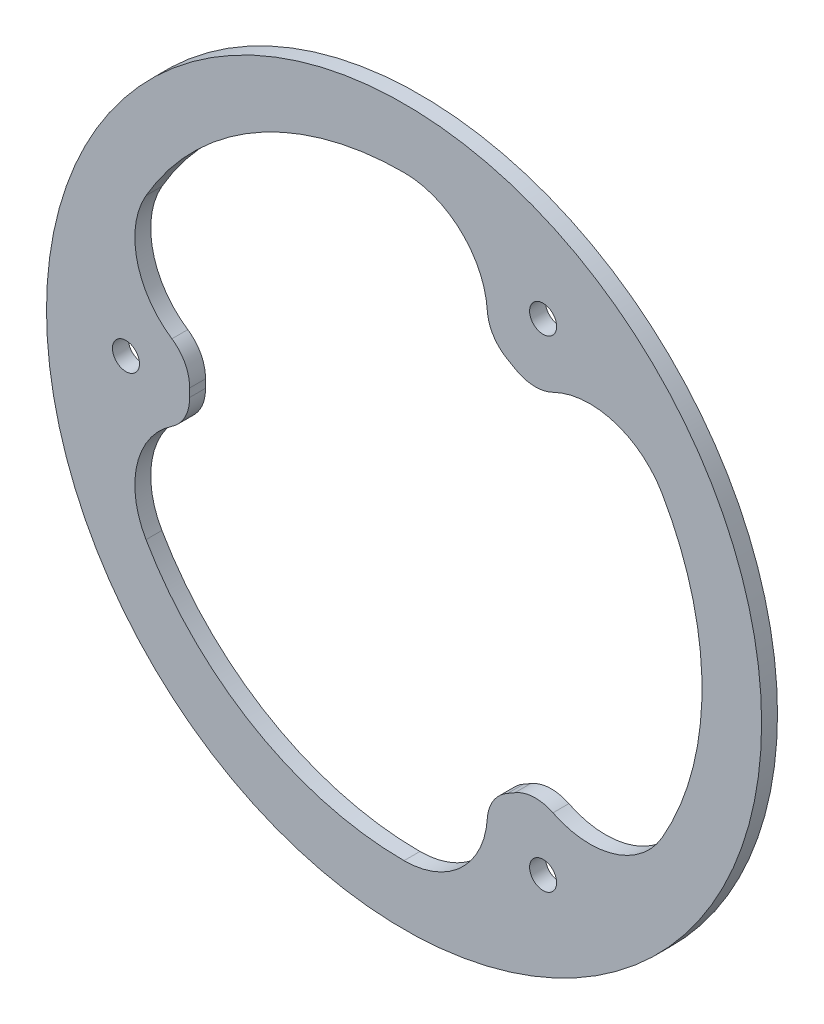
ISO-10303-21;
HEADER;
FILE_DESCRIPTION(('STEP AP214'),'2;1');
FILE_NAME('part.step','',(''),(''),'','','');
FILE_SCHEMA(('AUTOMOTIVE_DESIGN { 1 0 10303 214 1 1 1 1 }'));
ENDSEC;
DATA;
#1=APPLICATION_CONTEXT('core data for automotive mechanical design processes');
#2=APPLICATION_PROTOCOL_DEFINITION('international standard','automotive_design',2000,#1);
#3=PRODUCT_CONTEXT('',#1,'mechanical');
#4=PRODUCT('Part','Part','',(#3));
#5=PRODUCT_RELATED_PRODUCT_CATEGORY('part','',(#4));
#6=PRODUCT_DEFINITION_FORMATION('','',#4);
#7=PRODUCT_DEFINITION_CONTEXT('part definition',#1,'design');
#8=PRODUCT_DEFINITION('design','',#6,#7);
#9=PRODUCT_DEFINITION_SHAPE('','',#8);
#10=(LENGTH_UNIT() NAMED_UNIT(*) SI_UNIT(.MILLI.,.METRE.));
#11=(NAMED_UNIT(*) PLANE_ANGLE_UNIT() SI_UNIT($,.RADIAN.));
#12=(NAMED_UNIT(*) SI_UNIT($,.STERADIAN.) SOLID_ANGLE_UNIT());
#13=UNCERTAINTY_MEASURE_WITH_UNIT(LENGTH_MEASURE(1.E-05),#10,'distance_accuracy_value','');
#14=(GEOMETRIC_REPRESENTATION_CONTEXT(3) GLOBAL_UNCERTAINTY_ASSIGNED_CONTEXT((#13)) GLOBAL_UNIT_ASSIGNED_CONTEXT((#10,
#11,#12)) REPRESENTATION_CONTEXT('',''));
#15=CARTESIAN_POINT('',(0.,0.,0.));
#16=DIRECTION('',(0.,0.,1.));
#17=DIRECTION('',(1.,0.,0.));
#18=AXIS2_PLACEMENT_3D('',#15,#16,#17);
#19=CARTESIAN_POINT('',(0.,0.,14.));
#20=DIRECTION('',(0.,0.,1.));
#21=DIRECTION('',(1.,0.,0.));
#22=AXIS2_PLACEMENT_3D('',#19,#20,#21);
#23=PLANE('',#22);
#24=CARTESIAN_POINT('',(0.,0.,14.));
#25=DIRECTION('',(0.,0.,-1.));
#26=DIRECTION('',(-1.,0.,0.));
#27=AXIS2_PLACEMENT_3D('',#24,#25,#26);
#28=CIRCLE('',#27,27.);
#29=CARTESIAN_POINT('',(-26.9950568827488,-0.516627425867208,14.));
#30=VERTEX_POINT('',#29);
#31=CARTESIAN_POINT('',(-26.9950568827488,0.516627425867155,14.));
#32=VERTEX_POINT('',#31);
#33=EDGE_CURVE('E288',#30,#32,#28,.T.);
#34=ORIENTED_EDGE('',*,*,#33,.T.);
#35=CARTESIAN_POINT('',(-31.9941414906652,0.612299171398109,14.));
#36=DIRECTION('',(0.,0.,1.));
#37=DIRECTION('',(1.,0.,0.));
#38=AXIS2_PLACEMENT_3D('',#35,#36,#37);
#39=CIRCLE('',#38,5.);
#40=CARTESIAN_POINT('',(-29.2162525911538,4.76962201933419,14.));
#41=VERTEX_POINT('',#40);
#42=EDGE_CURVE('E262',#32,#41,#39,.T.);
#43=ORIENTED_EDGE('',*,*,#42,.T.);
#44=CARTESIAN_POINT('',(-23.3826859021799,13.4999999999999,14.));
#45=DIRECTION('',(0.,0.,-1.));
#46=DIRECTION('',(-1.,0.,0.));
#47=AXIS2_PLACEMENT_3D('',#44,#45,#46);
#48=CIRCLE('',#47,10.5);
#49=CARTESIAN_POINT('',(-32.4759526419165,18.7499999999999,14.));
#50=VERTEX_POINT('',#49);
#51=EDGE_CURVE('E209',#41,#50,#48,.T.);
#52=ORIENTED_EDGE('',*,*,#51,.T.);
#53=CARTESIAN_POINT('',(0.,0.,14.));
#54=DIRECTION('',(0.,0.,-1.));
#55=DIRECTION('',(-1.,0.,0.));
#56=AXIS2_PLACEMENT_3D('',#53,#54,#55);
#57=CIRCLE('',#56,37.5);
#58=CARTESIAN_POINT('',(0.,37.5,14.));
#59=VERTEX_POINT('',#58);
#60=EDGE_CURVE('E213',#50,#59,#57,.T.);
#61=ORIENTED_EDGE('',*,*,#60,.T.);
#62=CARTESIAN_POINT('',(0.,27.,14.));
#63=DIRECTION('',(0.,0.,-1.));
#64=DIRECTION('',(-1.,0.,0.));
#65=AXIS2_PLACEMENT_3D('',#62,#63,#64);
#66=CIRCLE('',#65,10.5);
#67=CARTESIAN_POINT('',(10.4775124603838,27.6868279569892,14.));
#68=VERTEX_POINT('',#67);
#69=EDGE_CURVE('E216',#59,#68,#66,.T.);
#70=ORIENTED_EDGE('',*,*,#69,.T.);
#71=CARTESIAN_POINT('',(15.4668041081856,28.0138888888889,14.));
#72=DIRECTION('',(0.,0.,1.));
#73=DIRECTION('',(1.,0.,0.));
#74=AXIS2_PLACEMENT_3D('',#71,#72,#73);
#75=CIRCLE('',#74,5.);
#76=CARTESIAN_POINT('',(13.0501159662816,23.63671875,14.));
#77=VERTEX_POINT('',#76);
#78=EDGE_CURVE('E51',#68,#77,#75,.T.);
#79=ORIENTED_EDGE('',*,*,#78,.T.);
#80=CARTESIAN_POINT('',(13.9449409164671,23.1200913241328,14.));
#81=VERTEX_POINT('',#80);
#82=EDGE_CURVE('E236',#77,#81,#28,.T.);
#83=ORIENTED_EDGE('',*,*,#82,.T.);
#84=CARTESIAN_POINT('',(16.5273373824795,27.4015897174907,14.));
#85=DIRECTION('',(0.,0.,1.));
#86=DIRECTION('',(1.,0.,0.));
#87=AXIS2_PLACEMENT_3D('',#84,#85,#86);
#88=CIRCLE('',#87,5.);
#89=CARTESIAN_POINT('',(18.7387401307699,22.917205937655,14.));
#90=VERTEX_POINT('',#89);
#91=EDGE_CURVE('E254',#81,#90,#88,.T.);
#92=ORIENTED_EDGE('',*,*,#91,.T.);
#93=CARTESIAN_POINT('',(23.3826859021798,13.5,14.));
#94=DIRECTION('',(0.,0.,-1.));
#95=DIRECTION('',(-1.,0.,0.));
#96=AXIS2_PLACEMENT_3D('',#93,#94,#95);
#97=CIRCLE('',#96,10.5);
#98=CARTESIAN_POINT('',(32.4759526419164,18.7500000000001,14.));
#99=VERTEX_POINT('',#98);
#100=EDGE_CURVE('E327',#90,#99,#97,.T.);
#101=ORIENTED_EDGE('',*,*,#100,.T.);
#102=CARTESIAN_POINT('',(0.,0.,14.));
#103=DIRECTION('',(0.,0.,-1.));
#104=DIRECTION('',(-1.,0.,0.));
#105=AXIS2_PLACEMENT_3D('',#102,#103,#104);
#106=CIRCLE('',#105,37.5);
#107=CARTESIAN_POINT('',(32.4759526419165,-18.75,14.));
#108=VERTEX_POINT('',#107);
#109=EDGE_CURVE('E328',#99,#108,#106,.T.);
#110=ORIENTED_EDGE('',*,*,#109,.T.);
#111=CARTESIAN_POINT('',(23.3826859021798,-13.5,14.));
#112=DIRECTION('',(0.,0.,-1.));
#113=DIRECTION('',(-1.,0.,0.));
#114=AXIS2_PLACEMENT_3D('',#111,#112,#113);
#115=CIRCLE('',#114,10.5);
#116=CARTESIAN_POINT('',(18.73874013077,-22.917205937655,14.));
#117=VERTEX_POINT('',#116);
#118=EDGE_CURVE('E190',#108,#117,#115,.T.);
#119=ORIENTED_EDGE('',*,*,#118,.T.);
#120=CARTESIAN_POINT('',(16.5273373824796,-27.4015897174907,14.));
#121=DIRECTION('',(0.,0.,1.));
#122=DIRECTION('',(1.,0.,0.));
#123=AXIS2_PLACEMENT_3D('',#120,#121,#122);
#124=CIRCLE('',#123,5.);
#125=CARTESIAN_POINT('',(13.9449409164672,-23.1200913241328,14.));
#126=VERTEX_POINT('',#125);
#127=EDGE_CURVE('E259',#117,#126,#124,.T.);
#128=ORIENTED_EDGE('',*,*,#127,.T.);
#129=CARTESIAN_POINT('',(13.0501159662817,-23.63671875,14.));
#130=VERTEX_POINT('',#129);
#131=EDGE_CURVE('E331',#126,#130,#28,.T.);
#132=ORIENTED_EDGE('',*,*,#131,.T.);
#133=CARTESIAN_POINT('',(15.4668041081857,-28.0138888888889,14.));
#134=DIRECTION('',(0.,0.,1.));
#135=DIRECTION('',(1.,0.,0.));
#136=AXIS2_PLACEMENT_3D('',#133,#134,#135);
#137=CIRCLE('',#136,5.);
#138=CARTESIAN_POINT('',(10.4775124603839,-27.6868279569892,14.));
#139=VERTEX_POINT('',#138);
#140=EDGE_CURVE('E257',#130,#139,#137,.T.);
#141=ORIENTED_EDGE('',*,*,#140,.T.);
#142=CARTESIAN_POINT('',(0.,-27.,14.));
#143=DIRECTION('',(0.,0.,-1.));
#144=DIRECTION('',(-1.,0.,0.));
#145=AXIS2_PLACEMENT_3D('',#142,#143,#144);
#146=CIRCLE('',#145,10.5);
#147=CARTESIAN_POINT('',(0.,-37.5,14.));
#148=VERTEX_POINT('',#147);
#149=EDGE_CURVE('E192',#139,#148,#146,.T.);
#150=ORIENTED_EDGE('',*,*,#149,.T.);
#151=CARTESIAN_POINT('',(0.,0.,14.));
#152=DIRECTION('',(0.,0.,-1.));
#153=DIRECTION('',(-1.,0.,0.));
#154=AXIS2_PLACEMENT_3D('',#151,#152,#153);
#155=CIRCLE('',#154,37.5);
#156=CARTESIAN_POINT('',(-32.4759526419165,-18.75,14.));
#157=VERTEX_POINT('',#156);
#158=EDGE_CURVE('E194',#148,#157,#155,.T.);
#159=ORIENTED_EDGE('',*,*,#158,.T.);
#160=CARTESIAN_POINT('',(-23.3826859021798,-13.5,14.));
#161=DIRECTION('',(0.,0.,-1.));
#162=DIRECTION('',(-1.,0.,0.));
#163=AXIS2_PLACEMENT_3D('',#160,#161,#162);
#164=CIRCLE('',#163,10.5);
#165=CARTESIAN_POINT('',(-29.2162525911538,-4.76962201933425,14.));
#166=VERTEX_POINT('',#165);
#167=EDGE_CURVE('E202',#157,#166,#164,.T.);
#168=ORIENTED_EDGE('',*,*,#167,.T.);
#169=CARTESIAN_POINT('',(-31.9941414906652,-0.612299171398172,14.));
#170=DIRECTION('',(0.,0.,1.));
#171=DIRECTION('',(1.,0.,0.));
#172=AXIS2_PLACEMENT_3D('',#169,#170,#171);
#173=CIRCLE('',#172,5.);
#174=EDGE_CURVE('E59',#166,#30,#173,.T.);
#175=ORIENTED_EDGE('',*,*,#174,.T.);
#176=EDGE_LOOP('',(#34,#43,#52,#61,#70,#79,#83,#92,#101,#110,#119,#128,#132,#141,#150,#159,#168,#175));
#177=FACE_BOUND('',#176,.T.);
#178=CARTESIAN_POINT('',(17.4999999999999,30.3108891324554,14.));
#179=DIRECTION('',(0.,0.,-1.));
#180=DIRECTION('',(-1.,0.,0.));
#181=AXIS2_PLACEMENT_3D('',#178,#179,#180);
#182=CIRCLE('',#181,1.7);
#183=CARTESIAN_POINT('',(15.7999999999999,30.3108891324554,14.));
#184=VERTEX_POINT('',#183);
#185=EDGE_CURVE('E315',#184,#184,#182,.T.);
#186=ORIENTED_EDGE('',*,*,#185,.T.);
#187=EDGE_LOOP('',(#186));
#188=FACE_BOUND('',#187,.T.);
#189=CARTESIAN_POINT('',(-35.,0.,14.));
#190=DIRECTION('',(0.,0.,-1.));
#191=DIRECTION('',(-1.,0.,0.));
#192=AXIS2_PLACEMENT_3D('',#189,#190,#191);
#193=CIRCLE('',#192,1.7);
#194=CARTESIAN_POINT('',(-36.7,0.,14.));
#195=VERTEX_POINT('',#194);
#196=EDGE_CURVE('E321',#195,#195,#193,.T.);
#197=ORIENTED_EDGE('',*,*,#196,.T.);
#198=EDGE_LOOP('',(#197));
#199=FACE_BOUND('',#198,.T.);
#200=CARTESIAN_POINT('',(17.4999999999998,-30.3108891324555,14.));
#201=DIRECTION('',(0.,0.,-1.));
#202=DIRECTION('',(-1.,0.,0.));
#203=AXIS2_PLACEMENT_3D('',#200,#201,#202);
#204=CIRCLE('',#203,1.7);
#205=CARTESIAN_POINT('',(15.7999999999998,-30.3108891324555,14.));
#206=VERTEX_POINT('',#205);
#207=EDGE_CURVE('E324',#206,#206,#204,.T.);
#208=ORIENTED_EDGE('',*,*,#207,.T.);
#209=EDGE_LOOP('',(#208));
#210=FACE_BOUND('',#209,.T.);
#211=CARTESIAN_POINT('',(0.,0.,14.));
#212=DIRECTION('',(0.,0.,1.));
#213=DIRECTION('',(1.,0.,0.));
#214=AXIS2_PLACEMENT_3D('',#211,#212,#213);
#215=CIRCLE('',#214,45.);
#216=CARTESIAN_POINT('',(45.,0.,14.));
#217=VERTEX_POINT('',#216);
#218=EDGE_CURVE('E226',#217,#217,#215,.T.);
#219=ORIENTED_EDGE('',*,*,#218,.T.);
#220=EDGE_LOOP('',(#219));
#221=FACE_BOUND('',#220,.T.);
#222=ADVANCED_FACE('F36',(#177,#188,#199,#210,#221),#23,.T.);
#223=CARTESIAN_POINT('',(0.,0.,12.));
#224=DIRECTION('',(0.,0.,1.));
#225=DIRECTION('',(1.,0.,0.));
#226=AXIS2_PLACEMENT_3D('',#223,#224,#225);
#227=PLANE('',#226);
#228=CARTESIAN_POINT('',(0.,0.,12.));
#229=DIRECTION('',(0.,0.,1.));
#230=DIRECTION('',(1.,0.,0.));
#231=AXIS2_PLACEMENT_3D('',#228,#229,#230);
#232=CIRCLE('',#231,45.);
#233=CARTESIAN_POINT('',(45.,0.,12.));
#234=VERTEX_POINT('',#233);
#235=EDGE_CURVE('E223',#234,#234,#232,.T.);
#236=ORIENTED_EDGE('',*,*,#235,.F.);
#237=EDGE_LOOP('',(#236));
#238=FACE_BOUND('',#237,.T.);
#239=CARTESIAN_POINT('',(17.4999999999998,-30.3108891324555,12.));
#240=DIRECTION('',(0.,0.,1.));
#241=DIRECTION('',(1.,0.,0.));
#242=AXIS2_PLACEMENT_3D('',#239,#240,#241);
#243=CIRCLE('',#242,1.69999999999999);
#244=CARTESIAN_POINT('',(19.1999999999998,-30.3108891324555,12.));
#245=VERTEX_POINT('',#244);
#246=EDGE_CURVE('E384',#245,#245,#243,.F.);
#247=ORIENTED_EDGE('',*,*,#246,.F.);
#248=EDGE_LOOP('',(#247));
#249=FACE_BOUND('',#248,.T.);
#250=CARTESIAN_POINT('',(17.4999999999999,30.3108891324554,12.));
#251=DIRECTION('',(0.,0.,1.));
#252=DIRECTION('',(1.,0.,0.));
#253=AXIS2_PLACEMENT_3D('',#250,#251,#252);
#254=CIRCLE('',#253,1.69999999999999);
#255=CARTESIAN_POINT('',(19.1999999999999,30.3108891324554,12.));
#256=VERTEX_POINT('',#255);
#257=EDGE_CURVE('E232',#256,#256,#254,.F.);
#258=ORIENTED_EDGE('',*,*,#257,.F.);
#259=EDGE_LOOP('',(#258));
#260=FACE_BOUND('',#259,.T.);
#261=CARTESIAN_POINT('',(-35.,0.,12.));
#262=DIRECTION('',(0.,0.,1.));
#263=DIRECTION('',(1.,0.,0.));
#264=AXIS2_PLACEMENT_3D('',#261,#262,#263);
#265=CIRCLE('',#264,1.69999999999999);
#266=CARTESIAN_POINT('',(-33.3,0.,12.));
#267=VERTEX_POINT('',#266);
#268=EDGE_CURVE('E235',#267,#267,#265,.F.);
#269=ORIENTED_EDGE('',*,*,#268,.F.);
#270=EDGE_LOOP('',(#269));
#271=FACE_BOUND('',#270,.T.);
#272=CARTESIAN_POINT('',(-23.3826859021799,13.4999999999999,12.));
#273=DIRECTION('',(0.,0.,1.));
#274=DIRECTION('',(1.,0.,0.));
#275=AXIS2_PLACEMENT_3D('',#272,#273,#274);
#276=CIRCLE('',#275,10.5);
#277=CARTESIAN_POINT('',(-29.2162525911538,4.76962201933419,12.));
#278=VERTEX_POINT('',#277);
#279=CARTESIAN_POINT('',(-32.4759526419165,18.7499999999999,12.));
#280=VERTEX_POINT('',#279);
#281=EDGE_CURVE('E309',#278,#280,#276,.F.);
#282=ORIENTED_EDGE('',*,*,#281,.F.);
#283=CARTESIAN_POINT('',(-31.9941414906652,0.612299171398109,12.));
#284=DIRECTION('',(0.,0.,1.));
#285=DIRECTION('',(1.,0.,0.));
#286=AXIS2_PLACEMENT_3D('',#283,#284,#285);
#287=CIRCLE('',#286,5.);
#288=CARTESIAN_POINT('',(-26.9950568827488,0.516627425867155,12.));
#289=VERTEX_POINT('',#288);
#290=EDGE_CURVE('E248',#278,#289,#287,.F.);
#291=ORIENTED_EDGE('',*,*,#290,.T.);
#292=CARTESIAN_POINT('',(0.,0.,12.));
#293=DIRECTION('',(0.,0.,-1.));
#294=DIRECTION('',(-1.,0.,0.));
#295=AXIS2_PLACEMENT_3D('',#292,#293,#294);
#296=CIRCLE('',#295,27.);
#297=CARTESIAN_POINT('',(-26.9950568827488,-0.516627425867208,12.));
#298=VERTEX_POINT('',#297);
#299=EDGE_CURVE('E291',#298,#289,#296,.T.);
#300=ORIENTED_EDGE('',*,*,#299,.F.);
#301=CARTESIAN_POINT('',(-31.9941414906652,-0.612299171398172,12.));
#302=DIRECTION('',(0.,0.,1.));
#303=DIRECTION('',(1.,0.,0.));
#304=AXIS2_PLACEMENT_3D('',#301,#302,#303);
#305=CIRCLE('',#304,5.);
#306=CARTESIAN_POINT('',(-29.2162525911538,-4.76962201933425,12.));
#307=VERTEX_POINT('',#306);
#308=EDGE_CURVE('E246',#298,#307,#305,.F.);
#309=ORIENTED_EDGE('',*,*,#308,.T.);
#310=CARTESIAN_POINT('',(-23.3826859021798,-13.5,12.));
#311=DIRECTION('',(0.,0.,1.));
#312=DIRECTION('',(1.,0.,0.));
#313=AXIS2_PLACEMENT_3D('',#310,#311,#312);
#314=CIRCLE('',#313,10.5);
#315=CARTESIAN_POINT('',(-32.4759526419165,-18.75,12.));
#316=VERTEX_POINT('',#315);
#317=EDGE_CURVE('E312',#316,#307,#314,.F.);
#318=ORIENTED_EDGE('',*,*,#317,.F.);
#319=CARTESIAN_POINT('',(0.,0.,12.));
#320=DIRECTION('',(0.,0.,1.));
#321=DIRECTION('',(1.,0.,0.));
#322=AXIS2_PLACEMENT_3D('',#319,#320,#321);
#323=CIRCLE('',#322,37.5);
#324=CARTESIAN_POINT('',(0.,-37.5,12.));
#325=VERTEX_POINT('',#324);
#326=EDGE_CURVE('E391',#325,#316,#323,.F.);
#327=ORIENTED_EDGE('',*,*,#326,.F.);
#328=CARTESIAN_POINT('',(0.,-27.,12.));
#329=DIRECTION('',(0.,0.,1.));
#330=DIRECTION('',(1.,0.,0.));
#331=AXIS2_PLACEMENT_3D('',#328,#329,#330);
#332=CIRCLE('',#331,10.5);
#333=CARTESIAN_POINT('',(10.4775124603839,-27.6868279569892,12.));
#334=VERTEX_POINT('',#333);
#335=EDGE_CURVE('E177',#334,#325,#332,.F.);
#336=ORIENTED_EDGE('',*,*,#335,.F.);
#337=CARTESIAN_POINT('',(15.4668041081857,-28.0138888888889,12.));
#338=DIRECTION('',(0.,0.,1.));
#339=DIRECTION('',(1.,0.,0.));
#340=AXIS2_PLACEMENT_3D('',#337,#338,#339);
#341=CIRCLE('',#340,5.);
#342=CARTESIAN_POINT('',(13.0501159662817,-23.63671875,12.));
#343=VERTEX_POINT('',#342);
#344=EDGE_CURVE('E243',#334,#343,#341,.F.);
#345=ORIENTED_EDGE('',*,*,#344,.T.);
#346=CARTESIAN_POINT('',(13.9449409164672,-23.1200913241328,12.));
#347=VERTEX_POINT('',#346);
#348=EDGE_CURVE('E289',#347,#343,#296,.T.);
#349=ORIENTED_EDGE('',*,*,#348,.F.);
#350=CARTESIAN_POINT('',(16.5273373824796,-27.4015897174907,12.));
#351=DIRECTION('',(0.,0.,1.));
#352=DIRECTION('',(1.,0.,0.));
#353=AXIS2_PLACEMENT_3D('',#350,#351,#352);
#354=CIRCLE('',#353,5.);
#355=CARTESIAN_POINT('',(18.73874013077,-22.917205937655,12.));
#356=VERTEX_POINT('',#355);
#357=EDGE_CURVE('E172',#347,#356,#354,.F.);
#358=ORIENTED_EDGE('',*,*,#357,.T.);
#359=CARTESIAN_POINT('',(23.3826859021798,-13.5,12.));
#360=DIRECTION('',(0.,0.,1.));
#361=DIRECTION('',(1.,0.,0.));
#362=AXIS2_PLACEMENT_3D('',#359,#360,#361);
#363=CIRCLE('',#362,10.5);
#364=CARTESIAN_POINT('',(32.4759526419164,-18.75,12.));
#365=VERTEX_POINT('',#364);
#366=EDGE_CURVE('E163',#365,#356,#363,.F.);
#367=ORIENTED_EDGE('',*,*,#366,.F.);
#368=CARTESIAN_POINT('',(0.,0.,12.));
#369=DIRECTION('',(0.,0.,1.));
#370=DIRECTION('',(1.,0.,0.));
#371=AXIS2_PLACEMENT_3D('',#368,#369,#370);
#372=CIRCLE('',#371,37.5);
#373=CARTESIAN_POINT('',(32.4759526419164,18.7500000000001,12.));
#374=VERTEX_POINT('',#373);
#375=EDGE_CURVE('E168',#374,#365,#372,.F.);
#376=ORIENTED_EDGE('',*,*,#375,.F.);
#377=CARTESIAN_POINT('',(23.3826859021798,13.5,12.));
#378=DIRECTION('',(0.,0.,1.));
#379=DIRECTION('',(1.,0.,0.));
#380=AXIS2_PLACEMENT_3D('',#377,#378,#379);
#381=CIRCLE('',#380,10.5);
#382=CARTESIAN_POINT('',(18.7387401307699,22.917205937655,12.));
#383=VERTEX_POINT('',#382);
#384=EDGE_CURVE('E186',#383,#374,#381,.F.);
#385=ORIENTED_EDGE('',*,*,#384,.F.);
#386=CARTESIAN_POINT('',(16.5273373824795,27.4015897174907,12.));
#387=DIRECTION('',(0.,0.,1.));
#388=DIRECTION('',(1.,0.,0.));
#389=AXIS2_PLACEMENT_3D('',#386,#387,#388);
#390=CIRCLE('',#389,5.);
#391=CARTESIAN_POINT('',(13.9449409164671,23.1200913241328,12.));
#392=VERTEX_POINT('',#391);
#393=EDGE_CURVE('E239',#383,#392,#390,.F.);
#394=ORIENTED_EDGE('',*,*,#393,.T.);
#395=CARTESIAN_POINT('',(13.0501159662816,23.63671875,12.));
#396=VERTEX_POINT('',#395);
#397=EDGE_CURVE('E283',#396,#392,#296,.T.);
#398=ORIENTED_EDGE('',*,*,#397,.F.);
#399=CARTESIAN_POINT('',(15.4668041081856,28.0138888888889,12.));
#400=DIRECTION('',(0.,0.,1.));
#401=DIRECTION('',(1.,0.,0.));
#402=AXIS2_PLACEMENT_3D('',#399,#400,#401);
#403=CIRCLE('',#402,5.);
#404=CARTESIAN_POINT('',(10.4775124603838,27.6868279569892,12.));
#405=VERTEX_POINT('',#404);
#406=EDGE_CURVE('E241',#396,#405,#403,.F.);
#407=ORIENTED_EDGE('',*,*,#406,.T.);
#408=CARTESIAN_POINT('',(0.,27.,12.));
#409=DIRECTION('',(0.,0.,1.));
#410=DIRECTION('',(1.,0.,0.));
#411=AXIS2_PLACEMENT_3D('',#408,#409,#410);
#412=CIRCLE('',#411,10.5);
#413=CARTESIAN_POINT('',(0.,37.5,12.));
#414=VERTEX_POINT('',#413);
#415=EDGE_CURVE('E296',#414,#405,#412,.F.);
#416=ORIENTED_EDGE('',*,*,#415,.F.);
#417=CARTESIAN_POINT('',(0.,0.,12.));
#418=DIRECTION('',(0.,0.,1.));
#419=DIRECTION('',(1.,0.,0.));
#420=AXIS2_PLACEMENT_3D('',#417,#418,#419);
#421=CIRCLE('',#420,37.5);
#422=EDGE_CURVE('E311',#280,#414,#421,.F.);
#423=ORIENTED_EDGE('',*,*,#422,.F.);
#424=EDGE_LOOP('',(#282,#291,#300,#309,#318,#327,#336,#345,#349,#358,#367,#376,#385,#394,#398,
#407,#416,#423));
#425=FACE_BOUND('',#424,.T.);
#426=ADVANCED_FACE('F166',(#238,#249,#260,#271,#425),#227,.F.);
#427=CARTESIAN_POINT('',(0.,0.,14.));
#428=DIRECTION('',(0.,0.,-1.));
#429=DIRECTION('',(-1.,0.,0.));
#430=AXIS2_PLACEMENT_3D('',#427,#428,#429);
#431=CYLINDRICAL_SURFACE('',#430,45.);
#432=ORIENTED_EDGE('',*,*,#218,.F.);
#433=EDGE_LOOP('',(#432));
#434=FACE_BOUND('',#433,.T.);
#435=ORIENTED_EDGE('',*,*,#235,.T.);
#436=EDGE_LOOP('',(#435));
#437=FACE_BOUND('',#436,.T.);
#438=ADVANCED_FACE('F358',(#434,#437),#431,.T.);
#439=CARTESIAN_POINT('',(0.,27.,14.));
#440=DIRECTION('',(0.,0.,-1.));
#441=DIRECTION('',(-1.,0.,0.));
#442=AXIS2_PLACEMENT_3D('',#439,#440,#441);
#443=CYLINDRICAL_SURFACE('',#442,10.5);
#444=ORIENTED_EDGE('',*,*,#415,.T.);
#445=DIRECTION('',(0.,0.,-1.));
#446=VECTOR('',#445,1.);
#447=CARTESIAN_POINT('',(10.4775124603838,27.6868279569892,14.));
#448=LINE('',#447,#446);
#449=EDGE_CURVE('E275',#405,#68,#448,.F.);
#450=ORIENTED_EDGE('',*,*,#449,.T.);
#451=ORIENTED_EDGE('',*,*,#69,.F.);
#452=DIRECTION('',(0.,0.,-1.));
#453=VECTOR('',#452,1.);
#454=CARTESIAN_POINT('',(0.,37.5,14.));
#455=LINE('',#454,#453);
#456=EDGE_CURVE('E220',#59,#414,#455,.T.);
#457=ORIENTED_EDGE('',*,*,#456,.T.);
#458=EDGE_LOOP('',(#444,#450,#451,#457));
#459=FACE_BOUND('',#458,.T.);
#460=ADVANCED_FACE('F295',(#459),#443,.F.);
#461=CARTESIAN_POINT('',(0.,0.,14.));
#462=DIRECTION('',(0.,0.,-1.));
#463=DIRECTION('',(-1.,0.,0.));
#464=AXIS2_PLACEMENT_3D('',#461,#462,#463);
#465=CYLINDRICAL_SURFACE('',#464,37.5);
#466=DIRECTION('',(0.,0.,-1.));
#467=VECTOR('',#466,1.);
#468=CARTESIAN_POINT('',(-32.4759526419165,18.7499999999999,14.));
#469=LINE('',#468,#467);
#470=EDGE_CURVE('E219',#50,#280,#469,.T.);
#471=ORIENTED_EDGE('',*,*,#470,.T.);
#472=ORIENTED_EDGE('',*,*,#422,.T.);
#473=ORIENTED_EDGE('',*,*,#456,.F.);
#474=ORIENTED_EDGE('',*,*,#60,.F.);
#475=EDGE_LOOP('',(#471,#472,#473,#474));
#476=FACE_BOUND('',#475,.T.);
#477=ADVANCED_FACE('F304',(#476),#465,.F.);
#478=CARTESIAN_POINT('',(-23.3826859021799,13.4999999999999,14.));
#479=DIRECTION('',(0.,0.,-1.));
#480=DIRECTION('',(-1.,0.,0.));
#481=AXIS2_PLACEMENT_3D('',#478,#479,#480);
#482=CYLINDRICAL_SURFACE('',#481,10.5);
#483=ORIENTED_EDGE('',*,*,#51,.F.);
#484=DIRECTION('',(0.,0.,-1.));
#485=VECTOR('',#484,1.);
#486=CARTESIAN_POINT('',(-29.2162525911538,4.76962201933419,14.));
#487=LINE('',#486,#485);
#488=EDGE_CURVE('E229',#41,#278,#487,.T.);
#489=ORIENTED_EDGE('',*,*,#488,.T.);
#490=ORIENTED_EDGE('',*,*,#281,.T.);
#491=ORIENTED_EDGE('',*,*,#470,.F.);
#492=EDGE_LOOP('',(#483,#489,#490,#491));
#493=FACE_BOUND('',#492,.T.);
#494=ADVANCED_FACE('F307',(#493),#482,.F.);
#495=CARTESIAN_POINT('',(-23.3826859021798,-13.5,14.));
#496=DIRECTION('',(0.,0.,-1.));
#497=DIRECTION('',(-1.,0.,0.));
#498=AXIS2_PLACEMENT_3D('',#495,#496,#497);
#499=CYLINDRICAL_SURFACE('',#498,10.5);
#500=ORIENTED_EDGE('',*,*,#317,.T.);
#501=DIRECTION('',(0.,0.,-1.));
#502=VECTOR('',#501,1.);
#503=CARTESIAN_POINT('',(-29.2162525911538,-4.76962201933424,14.));
#504=LINE('',#503,#502);
#505=EDGE_CURVE('E264',#307,#166,#504,.F.);
#506=ORIENTED_EDGE('',*,*,#505,.T.);
#507=ORIENTED_EDGE('',*,*,#167,.F.);
#508=DIRECTION('',(0.,0.,-1.));
#509=VECTOR('',#508,1.);
#510=CARTESIAN_POINT('',(-32.4759526419165,-18.75,14.));
#511=LINE('',#510,#509);
#512=EDGE_CURVE('E206',#157,#316,#511,.T.);
#513=ORIENTED_EDGE('',*,*,#512,.T.);
#514=EDGE_LOOP('',(#500,#506,#507,#513));
#515=FACE_BOUND('',#514,.T.);
#516=ADVANCED_FACE('F395',(#515),#499,.F.);
#517=CARTESIAN_POINT('',(0.,0.,14.));
#518=DIRECTION('',(0.,0.,-1.));
#519=DIRECTION('',(-1.,0.,0.));
#520=AXIS2_PLACEMENT_3D('',#517,#518,#519);
#521=CYLINDRICAL_SURFACE('',#520,37.5);
#522=DIRECTION('',(0.,0.,-1.));
#523=VECTOR('',#522,1.);
#524=CARTESIAN_POINT('',(0.,-37.5,14.));
#525=LINE('',#524,#523);
#526=EDGE_CURVE('E205',#148,#325,#525,.T.);
#527=ORIENTED_EDGE('',*,*,#526,.T.);
#528=ORIENTED_EDGE('',*,*,#326,.T.);
#529=ORIENTED_EDGE('',*,*,#512,.F.);
#530=ORIENTED_EDGE('',*,*,#158,.F.);
#531=EDGE_LOOP('',(#527,#528,#529,#530));
#532=FACE_BOUND('',#531,.T.);
#533=ADVANCED_FACE('F444',(#532),#521,.F.);
#534=CARTESIAN_POINT('',(0.,-27.,14.));
#535=DIRECTION('',(0.,0.,-1.));
#536=DIRECTION('',(-1.,0.,0.));
#537=AXIS2_PLACEMENT_3D('',#534,#535,#536);
#538=CYLINDRICAL_SURFACE('',#537,10.5);
#539=ORIENTED_EDGE('',*,*,#149,.F.);
#540=DIRECTION('',(0.,0.,-1.));
#541=VECTOR('',#540,1.);
#542=CARTESIAN_POINT('',(10.4775124603839,-27.6868279569892,14.));
#543=LINE('',#542,#541);
#544=EDGE_CURVE('E272',#139,#334,#543,.T.);
#545=ORIENTED_EDGE('',*,*,#544,.T.);
#546=ORIENTED_EDGE('',*,*,#335,.T.);
#547=ORIENTED_EDGE('',*,*,#526,.F.);
#548=EDGE_LOOP('',(#539,#545,#546,#547));
#549=FACE_BOUND('',#548,.T.);
#550=ADVANCED_FACE('F437',(#549),#538,.F.);
#551=CARTESIAN_POINT('',(23.3826859021798,-13.5,14.));
#552=DIRECTION('',(0.,0.,-1.));
#553=DIRECTION('',(-1.,0.,0.));
#554=AXIS2_PLACEMENT_3D('',#551,#552,#553);
#555=CYLINDRICAL_SURFACE('',#554,10.5);
#556=ORIENTED_EDGE('',*,*,#366,.T.);
#557=DIRECTION('',(0.,0.,-1.));
#558=VECTOR('',#557,1.);
#559=CARTESIAN_POINT('',(18.73874013077,-22.917205937655,14.));
#560=LINE('',#559,#558);
#561=EDGE_CURVE('E266',#356,#117,#560,.F.);
#562=ORIENTED_EDGE('',*,*,#561,.T.);
#563=ORIENTED_EDGE('',*,*,#118,.F.);
#564=DIRECTION('',(0.,0.,-1.));
#565=VECTOR('',#564,1.);
#566=CARTESIAN_POINT('',(32.4759526419165,-18.75,14.));
#567=LINE('',#566,#565);
#568=EDGE_CURVE('E182',#108,#365,#567,.T.);
#569=ORIENTED_EDGE('',*,*,#568,.T.);
#570=EDGE_LOOP('',(#556,#562,#563,#569));
#571=FACE_BOUND('',#570,.T.);
#572=ADVANCED_FACE('F188',(#571),#555,.F.);
#573=CARTESIAN_POINT('',(0.,0.,14.));
#574=DIRECTION('',(0.,0.,-1.));
#575=DIRECTION('',(-1.,0.,0.));
#576=AXIS2_PLACEMENT_3D('',#573,#574,#575);
#577=CYLINDRICAL_SURFACE('',#576,37.5);
#578=DIRECTION('',(0.,0.,-1.));
#579=VECTOR('',#578,1.);
#580=CARTESIAN_POINT('',(32.4759526419164,18.7500000000001,14.));
#581=LINE('',#580,#579);
#582=EDGE_CURVE('E185',#99,#374,#581,.T.);
#583=ORIENTED_EDGE('',*,*,#582,.T.);
#584=ORIENTED_EDGE('',*,*,#375,.T.);
#585=ORIENTED_EDGE('',*,*,#568,.F.);
#586=ORIENTED_EDGE('',*,*,#109,.F.);
#587=EDGE_LOOP('',(#583,#584,#585,#586));
#588=FACE_BOUND('',#587,.T.);
#589=ADVANCED_FACE('F180',(#588),#577,.F.);
#590=CARTESIAN_POINT('',(23.3826859021798,13.5,14.));
#591=DIRECTION('',(0.,0.,-1.));
#592=DIRECTION('',(-1.,0.,0.));
#593=AXIS2_PLACEMENT_3D('',#590,#591,#592);
#594=CYLINDRICAL_SURFACE('',#593,10.5);
#595=ORIENTED_EDGE('',*,*,#100,.F.);
#596=DIRECTION('',(0.,0.,-1.));
#597=VECTOR('',#596,1.);
#598=CARTESIAN_POINT('',(18.7387401307699,22.917205937655,14.));
#599=LINE('',#598,#597);
#600=EDGE_CURVE('E11',#90,#383,#599,.T.);
#601=ORIENTED_EDGE('',*,*,#600,.T.);
#602=ORIENTED_EDGE('',*,*,#384,.T.);
#603=ORIENTED_EDGE('',*,*,#582,.F.);
#604=EDGE_LOOP('',(#595,#601,#602,#603));
#605=FACE_BOUND('',#604,.T.);
#606=ADVANCED_FACE('F383',(#605),#594,.F.);
#607=CARTESIAN_POINT('',(17.4999999999998,-30.3108891324555,0.));
#608=DIRECTION('',(0.,0.,-1.));
#609=DIRECTION('',(-1.,0.,0.));
#610=AXIS2_PLACEMENT_3D('',#607,#608,#609);
#611=CYLINDRICAL_SURFACE('',#610,1.69999999999999);
#612=ORIENTED_EDGE('',*,*,#246,.T.);
#613=EDGE_LOOP('',(#612));
#614=FACE_BOUND('',#613,.T.);
#615=ORIENTED_EDGE('',*,*,#207,.F.);
#616=EDGE_LOOP('',(#615));
#617=FACE_BOUND('',#616,.T.);
#618=ADVANCED_FACE('F409',(#614,#617),#611,.F.);
#619=CARTESIAN_POINT('',(-35.,0.,0.));
#620=DIRECTION('',(0.,0.,-1.));
#621=DIRECTION('',(-1.,0.,0.));
#622=AXIS2_PLACEMENT_3D('',#619,#620,#621);
#623=CYLINDRICAL_SURFACE('',#622,1.69999999999999);
#624=ORIENTED_EDGE('',*,*,#268,.T.);
#625=EDGE_LOOP('',(#624));
#626=FACE_BOUND('',#625,.T.);
#627=ORIENTED_EDGE('',*,*,#196,.F.);
#628=EDGE_LOOP('',(#627));
#629=FACE_BOUND('',#628,.T.);
#630=ADVANCED_FACE('F404',(#626,#629),#623,.F.);
#631=CARTESIAN_POINT('',(17.4999999999999,30.3108891324554,0.));
#632=DIRECTION('',(0.,0.,-1.));
#633=DIRECTION('',(-1.,0.,0.));
#634=AXIS2_PLACEMENT_3D('',#631,#632,#633);
#635=CYLINDRICAL_SURFACE('',#634,1.69999999999999);
#636=ORIENTED_EDGE('',*,*,#257,.T.);
#637=EDGE_LOOP('',(#636));
#638=FACE_BOUND('',#637,.T.);
#639=ORIENTED_EDGE('',*,*,#185,.F.);
#640=EDGE_LOOP('',(#639));
#641=FACE_BOUND('',#640,.T.);
#642=ADVANCED_FACE('F408',(#638,#641),#635,.F.);
#643=CARTESIAN_POINT('',(0.,0.,14.));
#644=DIRECTION('',(0.,0.,-1.));
#645=DIRECTION('',(-1.,0.,0.));
#646=AXIS2_PLACEMENT_3D('',#643,#644,#645);
#647=CYLINDRICAL_SURFACE('',#646,27.);
#648=ORIENTED_EDGE('',*,*,#82,.F.);
#649=DIRECTION('',(0.,0.,-1.));
#650=VECTOR('',#649,1.);
#651=CARTESIAN_POINT('',(13.0501159662816,23.63671875,14.));
#652=LINE('',#651,#650);
#653=EDGE_CURVE('E44',#77,#396,#652,.T.);
#654=ORIENTED_EDGE('',*,*,#653,.T.);
#655=ORIENTED_EDGE('',*,*,#397,.T.);
#656=DIRECTION('',(0.,0.,-1.));
#657=VECTOR('',#656,1.);
#658=CARTESIAN_POINT('',(13.9449409164671,23.1200913241328,14.));
#659=LINE('',#658,#657);
#660=EDGE_CURVE('E277',#392,#81,#659,.F.);
#661=ORIENTED_EDGE('',*,*,#660,.T.);
#662=EDGE_LOOP('',(#648,#654,#655,#661));
#663=FACE_BOUND('',#662,.T.);
#664=ADVANCED_FACE('F282',(#663),#647,.F.);
#665=ORIENTED_EDGE('',*,*,#131,.F.);
#666=DIRECTION('',(0.,0.,-1.));
#667=VECTOR('',#666,1.);
#668=CARTESIAN_POINT('',(13.9449409164672,-23.1200913241328,14.));
#669=LINE('',#668,#667);
#670=EDGE_CURVE('E270',#126,#347,#669,.T.);
#671=ORIENTED_EDGE('',*,*,#670,.T.);
#672=ORIENTED_EDGE('',*,*,#348,.T.);
#673=DIRECTION('',(0.,0.,-1.));
#674=VECTOR('',#673,1.);
#675=CARTESIAN_POINT('',(13.0501159662817,-23.63671875,14.));
#676=LINE('',#675,#674);
#677=EDGE_CURVE('E268',#343,#130,#676,.F.);
#678=ORIENTED_EDGE('',*,*,#677,.T.);
#679=EDGE_LOOP('',(#665,#671,#672,#678));
#680=FACE_BOUND('',#679,.T.);
#681=ADVANCED_FACE('F336',(#680),#647,.F.);
#682=ORIENTED_EDGE('',*,*,#299,.T.);
#683=DIRECTION('',(0.,0.,-1.));
#684=VECTOR('',#683,1.);
#685=CARTESIAN_POINT('',(-26.9950568827488,0.516627425867155,14.));
#686=LINE('',#685,#684);
#687=EDGE_CURVE('E252',#289,#32,#686,.F.);
#688=ORIENTED_EDGE('',*,*,#687,.T.);
#689=ORIENTED_EDGE('',*,*,#33,.F.);
#690=DIRECTION('',(0.,0.,-1.));
#691=VECTOR('',#690,1.);
#692=CARTESIAN_POINT('',(-26.9950568827488,-0.516627425867208,14.));
#693=LINE('',#692,#691);
#694=EDGE_CURVE('E250',#30,#298,#693,.T.);
#695=ORIENTED_EDGE('',*,*,#694,.T.);
#696=EDGE_LOOP('',(#682,#688,#689,#695));
#697=FACE_BOUND('',#696,.T.);
#698=ADVANCED_FACE('F368',(#697),#647,.F.);
#699=CARTESIAN_POINT('',(-31.9941414906652,0.612299171398109,14.));
#700=DIRECTION('',(0.,0.,-1.));
#701=DIRECTION('',(-1.,0.,0.));
#702=AXIS2_PLACEMENT_3D('',#699,#700,#701);
#703=CYLINDRICAL_SURFACE('',#702,5.);
#704=ORIENTED_EDGE('',*,*,#42,.F.);
#705=ORIENTED_EDGE('',*,*,#687,.F.);
#706=ORIENTED_EDGE('',*,*,#290,.F.);
#707=ORIENTED_EDGE('',*,*,#488,.F.);
#708=EDGE_LOOP('',(#704,#705,#706,#707));
#709=FACE_BOUND('',#708,.T.);
#710=ADVANCED_FACE('F351',(#709),#703,.T.);
#711=CARTESIAN_POINT('',(-31.9941414906652,-0.612299171398172,14.));
#712=DIRECTION('',(0.,0.,1.));
#713=DIRECTION('',(1.,0.,0.));
#714=AXIS2_PLACEMENT_3D('',#711,#712,#713);
#715=CYLINDRICAL_SURFACE('',#714,5.);
#716=ORIENTED_EDGE('',*,*,#308,.F.);
#717=ORIENTED_EDGE('',*,*,#694,.F.);
#718=ORIENTED_EDGE('',*,*,#174,.F.);
#719=ORIENTED_EDGE('',*,*,#505,.F.);
#720=EDGE_LOOP('',(#716,#717,#718,#719));
#721=FACE_BOUND('',#720,.T.);
#722=ADVANCED_FACE('F343',(#721),#715,.T.);
#723=CARTESIAN_POINT('',(16.5273373824796,-27.4015897174907,14.));
#724=DIRECTION('',(0.,0.,1.));
#725=DIRECTION('',(1.,0.,0.));
#726=AXIS2_PLACEMENT_3D('',#723,#724,#725);
#727=CYLINDRICAL_SURFACE('',#726,5.);
#728=ORIENTED_EDGE('',*,*,#357,.F.);
#729=ORIENTED_EDGE('',*,*,#670,.F.);
#730=ORIENTED_EDGE('',*,*,#127,.F.);
#731=ORIENTED_EDGE('',*,*,#561,.F.);
#732=EDGE_LOOP('',(#728,#729,#730,#731));
#733=FACE_BOUND('',#732,.T.);
#734=ADVANCED_FACE('F340',(#733),#727,.T.);
#735=CARTESIAN_POINT('',(15.4668041081857,-28.0138888888889,14.));
#736=DIRECTION('',(0.,0.,-1.));
#737=DIRECTION('',(-1.,0.,0.));
#738=AXIS2_PLACEMENT_3D('',#735,#736,#737);
#739=CYLINDRICAL_SURFACE('',#738,5.);
#740=ORIENTED_EDGE('',*,*,#140,.F.);
#741=ORIENTED_EDGE('',*,*,#677,.F.);
#742=ORIENTED_EDGE('',*,*,#344,.F.);
#743=ORIENTED_EDGE('',*,*,#544,.F.);
#744=EDGE_LOOP('',(#740,#741,#742,#743));
#745=FACE_BOUND('',#744,.T.);
#746=ADVANCED_FACE('F342',(#745),#739,.T.);
#747=CARTESIAN_POINT('',(15.4668041081856,28.0138888888889,14.));
#748=DIRECTION('',(0.,0.,1.));
#749=DIRECTION('',(1.,0.,0.));
#750=AXIS2_PLACEMENT_3D('',#747,#748,#749);
#751=CYLINDRICAL_SURFACE('',#750,5.);
#752=ORIENTED_EDGE('',*,*,#406,.F.);
#753=ORIENTED_EDGE('',*,*,#653,.F.);
#754=ORIENTED_EDGE('',*,*,#78,.F.);
#755=ORIENTED_EDGE('',*,*,#449,.F.);
#756=EDGE_LOOP('',(#752,#753,#754,#755));
#757=FACE_BOUND('',#756,.T.);
#758=ADVANCED_FACE('F292',(#757),#751,.T.);
#759=CARTESIAN_POINT('',(16.5273373824795,27.4015897174907,14.));
#760=DIRECTION('',(0.,0.,-1.));
#761=DIRECTION('',(-1.,0.,0.));
#762=AXIS2_PLACEMENT_3D('',#759,#760,#761);
#763=CYLINDRICAL_SURFACE('',#762,5.);
#764=ORIENTED_EDGE('',*,*,#91,.F.);
#765=ORIENTED_EDGE('',*,*,#660,.F.);
#766=ORIENTED_EDGE('',*,*,#393,.F.);
#767=ORIENTED_EDGE('',*,*,#600,.F.);
#768=EDGE_LOOP('',(#764,#765,#766,#767));
#769=FACE_BOUND('',#768,.T.);
#770=ADVANCED_FACE('F38',(#769),#763,.T.);
#771=CLOSED_SHELL('',(#222,#426,#438,#460,#477,#494,#516,#533,#550,#572,#589,#606,#618,#630,
#642,#664,#681,#698,#710,#722,#734,#746,#758,#770));
#772=MANIFOLD_SOLID_BREP('B2',#771);
#773=ADVANCED_BREP_SHAPE_REPRESENTATION('',(#18,#772),#14);
#774=SHAPE_DEFINITION_REPRESENTATION(#9,#773);
ENDSEC;
END-ISO-10303-21;
